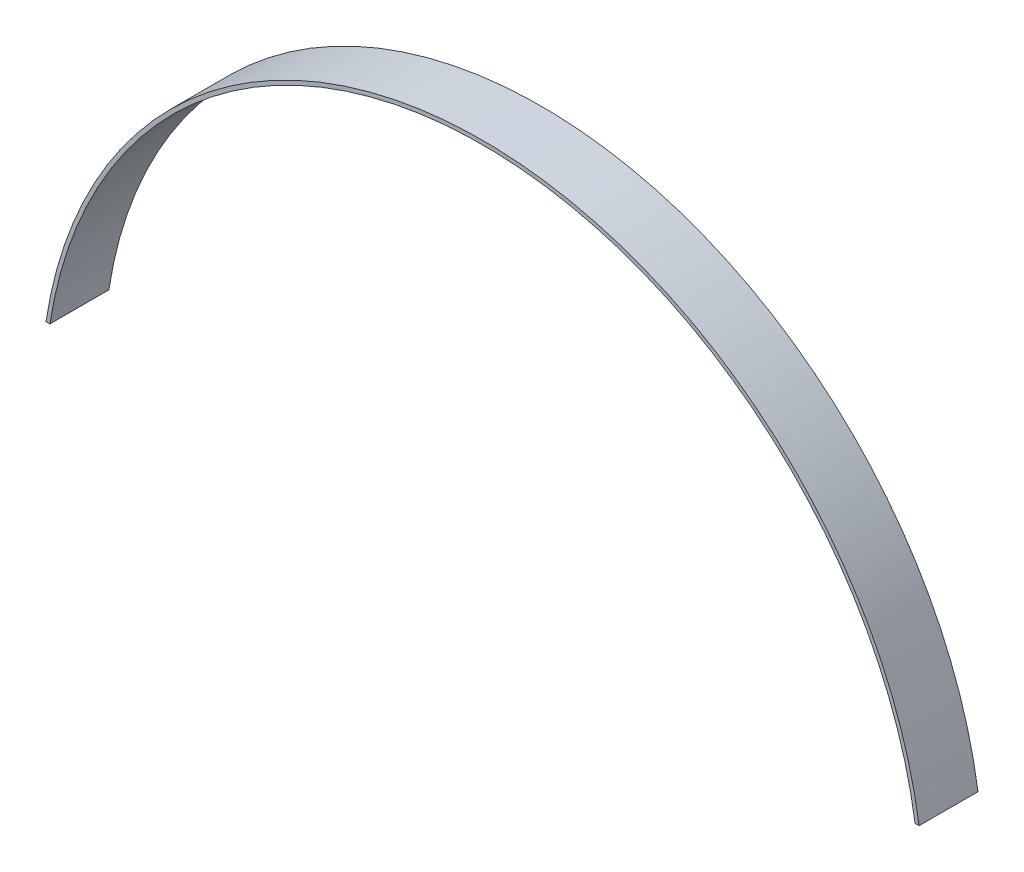
ISO-10303-21;
HEADER;
FILE_DESCRIPTION(('STEP AP214'),'2;1');
FILE_NAME('part.step','',(''),(''),'','','');
FILE_SCHEMA(('AUTOMOTIVE_DESIGN { 1 0 10303 214 1 1 1 1 }'));
ENDSEC;
DATA;
#1=APPLICATION_CONTEXT('core data for automotive mechanical design processes');
#2=APPLICATION_PROTOCOL_DEFINITION('international standard','automotive_design',2000,#1);
#3=PRODUCT_CONTEXT('',#1,'mechanical');
#4=PRODUCT('Part','Part','',(#3));
#5=PRODUCT_RELATED_PRODUCT_CATEGORY('part','',(#4));
#6=PRODUCT_DEFINITION_FORMATION('','',#4);
#7=PRODUCT_DEFINITION_CONTEXT('part definition',#1,'design');
#8=PRODUCT_DEFINITION('design','',#6,#7);
#9=PRODUCT_DEFINITION_SHAPE('','',#8);
#10=(LENGTH_UNIT() NAMED_UNIT(*) SI_UNIT(.MILLI.,.METRE.));
#11=(NAMED_UNIT(*) PLANE_ANGLE_UNIT() SI_UNIT($,.RADIAN.));
#12=(NAMED_UNIT(*) SI_UNIT($,.STERADIAN.) SOLID_ANGLE_UNIT());
#13=UNCERTAINTY_MEASURE_WITH_UNIT(LENGTH_MEASURE(1.E-05),#10,'distance_accuracy_value','');
#14=(GEOMETRIC_REPRESENTATION_CONTEXT(3) GLOBAL_UNCERTAINTY_ASSIGNED_CONTEXT((#13)) GLOBAL_UNIT_ASSIGNED_CONTEXT((#10,
#11,#12)) REPRESENTATION_CONTEXT('',''));
#15=CARTESIAN_POINT('',(0.,0.,0.));
#16=DIRECTION('',(0.,0.,1.));
#17=DIRECTION('',(1.,0.,0.));
#18=AXIS2_PLACEMENT_3D('',#15,#16,#17);
#19=CARTESIAN_POINT('',(20.5074699982484,-71.0108682985063,15.));
#20=DIRECTION('',(0.,0.,-1.));
#21=DIRECTION('',(-1.,0.,0.));
#22=AXIS2_PLACEMENT_3D('',#19,#20,#21);
#23=CYLINDRICAL_SURFACE('',#22,112.450004268705);
#24=CARTESIAN_POINT('',(20.5074699982484,-71.0108682985063,0.));
#25=DIRECTION('',(0.,0.,1.));
#26=DIRECTION('',(1.,0.,0.));
#27=AXIS2_PLACEMENT_3D('',#24,#25,#26);
#28=CIRCLE('',#27,112.450004268705);
#29=CARTESIAN_POINT('',(131.686791853924,-54.1537673691123,0.));
#30=VERTEX_POINT('',#29);
#31=CARTESIAN_POINT('',(-90.6718518574273,-54.1537673691123,0.));
#32=VERTEX_POINT('',#31);
#33=EDGE_CURVE('E96',#30,#32,#28,.T.);
#34=ORIENTED_EDGE('',*,*,#33,.T.);
#35=DIRECTION('',(0.,0.,-1.));
#36=VECTOR('',#35,1.);
#37=CARTESIAN_POINT('',(-90.6718518574273,-54.1537673691123,15.));
#38=LINE('',#37,#36);
#39=CARTESIAN_POINT('',(-90.6718518574273,-54.1537673691123,15.));
#40=VERTEX_POINT('',#39);
#41=EDGE_CURVE('E11',#40,#32,#38,.T.);
#42=ORIENTED_EDGE('',*,*,#41,.F.);
#43=CARTESIAN_POINT('',(20.5074699982484,-71.0108682985063,15.));
#44=DIRECTION('',(0.,0.,1.));
#45=DIRECTION('',(1.,0.,0.));
#46=AXIS2_PLACEMENT_3D('',#43,#44,#45);
#47=CIRCLE('',#46,112.450004268705);
#48=CARTESIAN_POINT('',(131.686791853924,-54.1537673691123,15.));
#49=VERTEX_POINT('',#48);
#50=EDGE_CURVE('E84',#49,#40,#47,.T.);
#51=ORIENTED_EDGE('',*,*,#50,.F.);
#52=DIRECTION('',(0.,0.,-1.));
#53=VECTOR('',#52,1.);
#54=CARTESIAN_POINT('',(131.686791853924,-54.1537673691123,15.));
#55=LINE('',#54,#53);
#56=EDGE_CURVE('E92',#49,#30,#55,.T.);
#57=ORIENTED_EDGE('',*,*,#56,.T.);
#58=EDGE_LOOP('',(#34,#42,#51,#57));
#59=FACE_BOUND('',#58,.T.);
#60=ADVANCED_FACE('F33',(#59),#23,.T.);
#61=CARTESIAN_POINT('',(-90.6718518574273,-54.1537673691123,15.));
#62=DIRECTION('',(0.,1.,0.));
#63=DIRECTION('',(0.,0.,1.));
#64=AXIS2_PLACEMENT_3D('',#61,#62,#63);
#65=PLANE('',#64);
#66=DIRECTION('',(1.,0.,0.));
#67=VECTOR('',#66,1.);
#68=CARTESIAN_POINT('',(-90.6718518574273,-54.1537673691123,0.));
#69=LINE('',#68,#67);
#70=CARTESIAN_POINT('',(-89.6603183963205,-54.1537673691123,0.));
#71=VERTEX_POINT('',#70);
#72=EDGE_CURVE('E88',#32,#71,#69,.T.);
#73=ORIENTED_EDGE('',*,*,#72,.T.);
#74=DIRECTION('',(0.,0.,-1.));
#75=VECTOR('',#74,1.);
#76=CARTESIAN_POINT('',(-89.6603183963205,-54.1537673691123,15.));
#77=LINE('',#76,#75);
#78=CARTESIAN_POINT('',(-89.6603183963205,-54.1537673691123,15.));
#79=VERTEX_POINT('',#78);
#80=EDGE_CURVE('E41',#79,#71,#77,.T.);
#81=ORIENTED_EDGE('',*,*,#80,.F.);
#82=DIRECTION('',(1.,0.,0.));
#83=VECTOR('',#82,1.);
#84=CARTESIAN_POINT('',(-90.6718518574273,-54.1537673691123,15.));
#85=LINE('',#84,#83);
#86=EDGE_CURVE('E79',#40,#79,#85,.T.);
#87=ORIENTED_EDGE('',*,*,#86,.F.);
#88=ORIENTED_EDGE('',*,*,#41,.T.);
#89=EDGE_LOOP('',(#73,#81,#87,#88));
#90=FACE_BOUND('',#89,.T.);
#91=ADVANCED_FACE('F87',(#90),#65,.F.);
#92=CARTESIAN_POINT('',(20.5074699982484,-71.0108682985063,15.));
#93=DIRECTION('',(0.,0.,-1.));
#94=DIRECTION('',(-1.,0.,0.));
#95=AXIS2_PLACEMENT_3D('',#92,#93,#94);
#96=CYLINDRICAL_SURFACE('',#95,111.450004268705);
#97=CARTESIAN_POINT('',(20.5074699982484,-71.0108682985063,0.));
#98=DIRECTION('',(0.,0.,-1.));
#99=DIRECTION('',(1.,0.,0.));
#100=AXIS2_PLACEMENT_3D('',#97,#98,#99);
#101=CIRCLE('',#100,111.450004268705);
#102=CARTESIAN_POINT('',(130.675258392817,-54.1537673691123,0.));
#103=VERTEX_POINT('',#102);
#104=EDGE_CURVE('E66',#71,#103,#101,.T.);
#105=ORIENTED_EDGE('',*,*,#104,.T.);
#106=DIRECTION('',(0.,0.,-1.));
#107=VECTOR('',#106,1.);
#108=CARTESIAN_POINT('',(130.675258392817,-54.1537673691123,15.));
#109=LINE('',#108,#107);
#110=CARTESIAN_POINT('',(130.675258392817,-54.1537673691123,15.));
#111=VERTEX_POINT('',#110);
#112=EDGE_CURVE('E89',#111,#103,#109,.T.);
#113=ORIENTED_EDGE('',*,*,#112,.F.);
#114=CARTESIAN_POINT('',(20.5074699982484,-71.0108682985063,15.));
#115=DIRECTION('',(0.,0.,-1.));
#116=DIRECTION('',(1.,0.,0.));
#117=AXIS2_PLACEMENT_3D('',#114,#115,#116);
#118=CIRCLE('',#117,111.450004268705);
#119=EDGE_CURVE('E82',#79,#111,#118,.T.);
#120=ORIENTED_EDGE('',*,*,#119,.F.);
#121=ORIENTED_EDGE('',*,*,#80,.T.);
#122=EDGE_LOOP('',(#105,#113,#120,#121));
#123=FACE_BOUND('',#122,.T.);
#124=ADVANCED_FACE('F90',(#123),#96,.F.);
#125=CARTESIAN_POINT('',(130.675258392817,-54.1537673691123,15.));
#126=DIRECTION('',(0.,1.,0.));
#127=DIRECTION('',(0.,0.,1.));
#128=AXIS2_PLACEMENT_3D('',#125,#126,#127);
#129=PLANE('',#128);
#130=DIRECTION('',(1.,0.,0.));
#131=VECTOR('',#130,1.);
#132=CARTESIAN_POINT('',(130.675258392817,-54.1537673691123,0.));
#133=LINE('',#132,#131);
#134=EDGE_CURVE('E72',#103,#30,#133,.T.);
#135=ORIENTED_EDGE('',*,*,#134,.T.);
#136=ORIENTED_EDGE('',*,*,#56,.F.);
#137=DIRECTION('',(1.,0.,0.));
#138=VECTOR('',#137,1.);
#139=CARTESIAN_POINT('',(130.675258392817,-54.1537673691123,15.));
#140=LINE('',#139,#138);
#141=EDGE_CURVE('E49',#111,#49,#140,.T.);
#142=ORIENTED_EDGE('',*,*,#141,.F.);
#143=ORIENTED_EDGE('',*,*,#112,.T.);
#144=EDGE_LOOP('',(#135,#136,#142,#143));
#145=FACE_BOUND('',#144,.T.);
#146=ADVANCED_FACE('F103',(#145),#129,.F.);
#147=CARTESIAN_POINT('',(20.5074699982484,-71.0108682985063,15.));
#148=DIRECTION('',(0.,0.,1.));
#149=DIRECTION('',(1.,0.,0.));
#150=AXIS2_PLACEMENT_3D('',#147,#148,#149);
#151=PLANE('',#150);
#152=ORIENTED_EDGE('',*,*,#50,.T.);
#153=ORIENTED_EDGE('',*,*,#86,.T.);
#154=ORIENTED_EDGE('',*,*,#119,.T.);
#155=ORIENTED_EDGE('',*,*,#141,.T.);
#156=EDGE_LOOP('',(#152,#153,#154,#155));
#157=FACE_BOUND('',#156,.T.);
#158=ADVANCED_FACE('F80',(#157),#151,.T.);
#159=CARTESIAN_POINT('',(20.5074699982484,-71.0108682985063,0.));
#160=DIRECTION('',(0.,0.,1.));
#161=DIRECTION('',(1.,0.,0.));
#162=AXIS2_PLACEMENT_3D('',#159,#160,#161);
#163=PLANE('',#162);
#164=ORIENTED_EDGE('',*,*,#33,.F.);
#165=ORIENTED_EDGE('',*,*,#134,.F.);
#166=ORIENTED_EDGE('',*,*,#104,.F.);
#167=ORIENTED_EDGE('',*,*,#72,.F.);
#168=EDGE_LOOP('',(#164,#165,#166,#167));
#169=FACE_BOUND('',#168,.T.);
#170=ADVANCED_FACE('F106',(#169),#163,.F.);
#171=CLOSED_SHELL('',(#60,#91,#124,#146,#158,#170));
#172=MANIFOLD_SOLID_BREP('B2',#171);
#173=ADVANCED_BREP_SHAPE_REPRESENTATION('',(#18,#172),#14);
#174=SHAPE_DEFINITION_REPRESENTATION(#9,#173);
ENDSEC;
END-ISO-10303-21;
